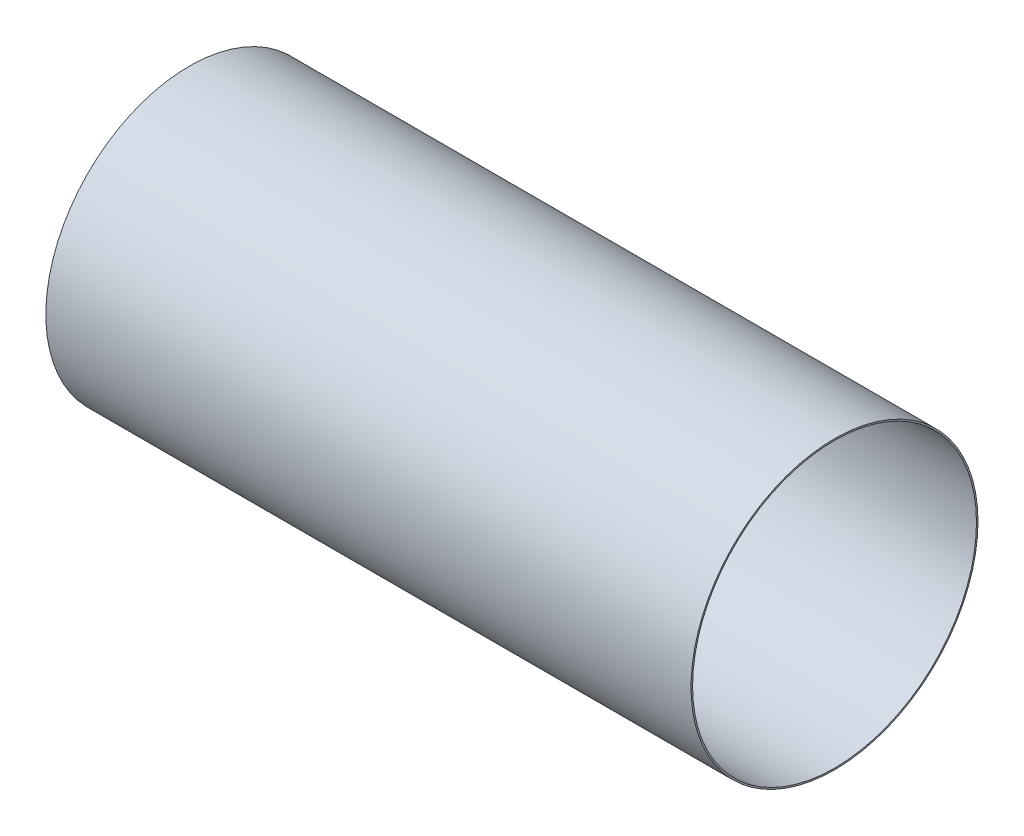
ISO-10303-21;
HEADER;
FILE_DESCRIPTION(('STEP AP214'),'2;1');
FILE_NAME('part.step','',(''),(''),'','','');
FILE_SCHEMA(('AUTOMOTIVE_DESIGN { 1 0 10303 214 1 1 1 1 }'));
ENDSEC;
DATA;
#1=APPLICATION_CONTEXT('core data for automotive mechanical design processes');
#2=APPLICATION_PROTOCOL_DEFINITION('international standard','automotive_design',2000,#1);
#3=PRODUCT_CONTEXT('',#1,'mechanical');
#4=PRODUCT('Part','Part','',(#3));
#5=PRODUCT_RELATED_PRODUCT_CATEGORY('part','',(#4));
#6=PRODUCT_DEFINITION_FORMATION('','',#4);
#7=PRODUCT_DEFINITION_CONTEXT('part definition',#1,'design');
#8=PRODUCT_DEFINITION('design','',#6,#7);
#9=PRODUCT_DEFINITION_SHAPE('','',#8);
#10=(LENGTH_UNIT() NAMED_UNIT(*) SI_UNIT(.MILLI.,.METRE.));
#11=(NAMED_UNIT(*) PLANE_ANGLE_UNIT() SI_UNIT($,.RADIAN.));
#12=(NAMED_UNIT(*) SI_UNIT($,.STERADIAN.) SOLID_ANGLE_UNIT());
#13=UNCERTAINTY_MEASURE_WITH_UNIT(LENGTH_MEASURE(1.E-05),#10,'distance_accuracy_value','');
#14=(GEOMETRIC_REPRESENTATION_CONTEXT(3) GLOBAL_UNCERTAINTY_ASSIGNED_CONTEXT((#13)) GLOBAL_UNIT_ASSIGNED_CONTEXT((#10,
#11,#12)) REPRESENTATION_CONTEXT('',''));
#15=CARTESIAN_POINT('',(0.,0.,0.));
#16=DIRECTION('',(0.,0.,1.));
#17=DIRECTION('',(1.,0.,0.));
#18=AXIS2_PLACEMENT_3D('',#15,#16,#17);
#19=CARTESIAN_POINT('',(127.,0.,0.));
#20=DIRECTION('',(1.,0.,0.));
#21=DIRECTION('',(0.,0.,-1.));
#22=AXIS2_PLACEMENT_3D('',#19,#20,#21);
#23=PLANE('',#22);
#24=CARTESIAN_POINT('',(127.,0.,0.));
#25=DIRECTION('',(1.,0.,0.));
#26=DIRECTION('',(0.,0.,-1.));
#27=AXIS2_PLACEMENT_3D('',#24,#25,#26);
#28=CIRCLE('',#27,28.24);
#29=CARTESIAN_POINT('',(127.,0.,-28.24));
#30=VERTEX_POINT('',#29);
#31=EDGE_CURVE('E10',#30,#30,#28,.T.);
#32=ORIENTED_EDGE('',*,*,#31,.T.);
#33=EDGE_LOOP('',(#32));
#34=FACE_BOUND('',#33,.T.);
#35=CARTESIAN_POINT('',(127.,0.,0.));
#36=DIRECTION('',(1.,0.,0.));
#37=DIRECTION('',(0.,0.,-1.));
#38=AXIS2_PLACEMENT_3D('',#35,#36,#37);
#39=CIRCLE('',#38,27.94);
#40=CARTESIAN_POINT('',(127.,0.,-27.94));
#41=VERTEX_POINT('',#40);
#42=EDGE_CURVE('E42',#41,#41,#39,.T.);
#43=ORIENTED_EDGE('',*,*,#42,.F.);
#44=EDGE_LOOP('',(#43));
#45=FACE_BOUND('',#44,.T.);
#46=ADVANCED_FACE('F31',(#34,#45),#23,.T.);
#47=CARTESIAN_POINT('',(0.,0.,0.));
#48=DIRECTION('',(1.,0.,0.));
#49=DIRECTION('',(0.,0.,-1.));
#50=AXIS2_PLACEMENT_3D('',#47,#48,#49);
#51=PLANE('',#50);
#52=CARTESIAN_POINT('',(0.,0.,0.));
#53=DIRECTION('',(1.,0.,0.));
#54=DIRECTION('',(0.,0.,-1.));
#55=AXIS2_PLACEMENT_3D('',#52,#53,#54);
#56=CIRCLE('',#55,28.24);
#57=CARTESIAN_POINT('',(0.,0.,-28.24));
#58=VERTEX_POINT('',#57);
#59=EDGE_CURVE('E35',#58,#58,#56,.T.);
#60=ORIENTED_EDGE('',*,*,#59,.F.);
#61=EDGE_LOOP('',(#60));
#62=FACE_BOUND('',#61,.T.);
#63=CARTESIAN_POINT('',(0.,0.,0.));
#64=DIRECTION('',(1.,0.,0.));
#65=DIRECTION('',(0.,0.,-1.));
#66=AXIS2_PLACEMENT_3D('',#63,#64,#65);
#67=CIRCLE('',#66,27.94);
#68=CARTESIAN_POINT('',(0.,0.,-27.94));
#69=VERTEX_POINT('',#68);
#70=EDGE_CURVE('E44',#69,#69,#67,.T.);
#71=ORIENTED_EDGE('',*,*,#70,.T.);
#72=EDGE_LOOP('',(#71));
#73=FACE_BOUND('',#72,.T.);
#74=ADVANCED_FACE('F54',(#62,#73),#51,.F.);
#75=CARTESIAN_POINT('',(127.,0.,0.));
#76=DIRECTION('',(-1.,0.,0.));
#77=DIRECTION('',(0.,0.,1.));
#78=AXIS2_PLACEMENT_3D('',#75,#76,#77);
#79=CYLINDRICAL_SURFACE('',#78,28.24);
#80=ORIENTED_EDGE('',*,*,#31,.F.);
#81=EDGE_LOOP('',(#80));
#82=FACE_BOUND('',#81,.T.);
#83=ORIENTED_EDGE('',*,*,#59,.T.);
#84=EDGE_LOOP('',(#83));
#85=FACE_BOUND('',#84,.T.);
#86=ADVANCED_FACE('F33',(#82,#85),#79,.T.);
#87=CARTESIAN_POINT('',(127.,0.,0.));
#88=DIRECTION('',(-1.,0.,0.));
#89=DIRECTION('',(0.,0.,1.));
#90=AXIS2_PLACEMENT_3D('',#87,#88,#89);
#91=CYLINDRICAL_SURFACE('',#90,27.94);
#92=ORIENTED_EDGE('',*,*,#42,.T.);
#93=EDGE_LOOP('',(#92));
#94=FACE_BOUND('',#93,.T.);
#95=ORIENTED_EDGE('',*,*,#70,.F.);
#96=EDGE_LOOP('',(#95));
#97=FACE_BOUND('',#96,.T.);
#98=ADVANCED_FACE('F50',(#94,#97),#91,.F.);
#99=CLOSED_SHELL('',(#46,#74,#86,#98));
#100=MANIFOLD_SOLID_BREP('B2',#99);
#101=ADVANCED_BREP_SHAPE_REPRESENTATION('',(#18,#100),#14);
#102=SHAPE_DEFINITION_REPRESENTATION(#9,#101);
ENDSEC;
END-ISO-10303-21;
